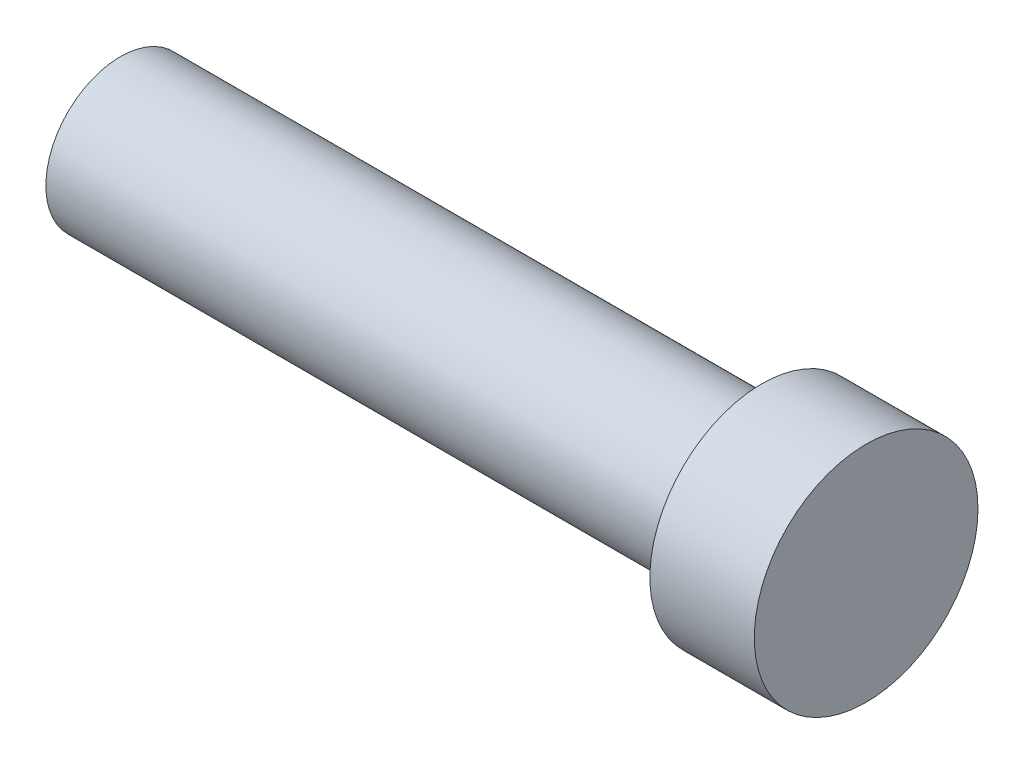
ISO-10303-21;
HEADER;
FILE_DESCRIPTION(('STEP AP214'),'2;1');
FILE_NAME('part.step','',(''),(''),'','','');
FILE_SCHEMA(('AUTOMOTIVE_DESIGN { 1 0 10303 214 1 1 1 1 }'));
ENDSEC;
DATA;
#1=APPLICATION_CONTEXT('core data for automotive mechanical design processes');
#2=APPLICATION_PROTOCOL_DEFINITION('international standard','automotive_design',2000,#1);
#3=PRODUCT_CONTEXT('',#1,'mechanical');
#4=PRODUCT('Part','Part','',(#3));
#5=PRODUCT_RELATED_PRODUCT_CATEGORY('part','',(#4));
#6=PRODUCT_DEFINITION_FORMATION('','',#4);
#7=PRODUCT_DEFINITION_CONTEXT('part definition',#1,'design');
#8=PRODUCT_DEFINITION('design','',#6,#7);
#9=PRODUCT_DEFINITION_SHAPE('','',#8);
#10=(LENGTH_UNIT() NAMED_UNIT(*) SI_UNIT(.MILLI.,.METRE.));
#11=(NAMED_UNIT(*) PLANE_ANGLE_UNIT() SI_UNIT($,.RADIAN.));
#12=(NAMED_UNIT(*) SI_UNIT($,.STERADIAN.) SOLID_ANGLE_UNIT());
#13=UNCERTAINTY_MEASURE_WITH_UNIT(LENGTH_MEASURE(1.E-05),#10,'distance_accuracy_value','');
#14=(GEOMETRIC_REPRESENTATION_CONTEXT(3) GLOBAL_UNCERTAINTY_ASSIGNED_CONTEXT((#13)) GLOBAL_UNIT_ASSIGNED_CONTEXT((#10,
#11,#12)) REPRESENTATION_CONTEXT('',''));
#15=CARTESIAN_POINT('',(0.,0.,0.));
#16=DIRECTION('',(0.,0.,1.));
#17=DIRECTION('',(1.,0.,0.));
#18=AXIS2_PLACEMENT_3D('',#15,#16,#17);
#19=CARTESIAN_POINT('',(-7.,0.,0.));
#20=DIRECTION('',(1.,0.,0.));
#21=DIRECTION('',(0.,0.,-1.));
#22=AXIS2_PLACEMENT_3D('',#19,#20,#21);
#23=CYLINDRICAL_SURFACE('',#22,7.5);
#24=CARTESIAN_POINT('',(-7.,0.,0.));
#25=DIRECTION('',(1.,0.,0.));
#26=DIRECTION('',(0.,0.,-1.));
#27=AXIS2_PLACEMENT_3D('',#24,#25,#26);
#28=CIRCLE('',#27,7.5);
#29=CARTESIAN_POINT('',(-7.,0.,-7.5));
#30=VERTEX_POINT('',#29);
#31=EDGE_CURVE('E10',#30,#30,#28,.T.);
#32=ORIENTED_EDGE('',*,*,#31,.T.);
#33=EDGE_LOOP('',(#32));
#34=FACE_BOUND('',#33,.T.);
#35=CARTESIAN_POINT('',(0.,0.,0.));
#36=DIRECTION('',(1.,0.,0.));
#37=DIRECTION('',(0.,0.,-1.));
#38=AXIS2_PLACEMENT_3D('',#35,#36,#37);
#39=CIRCLE('',#38,7.5);
#40=CARTESIAN_POINT('',(0.,0.,-7.5));
#41=VERTEX_POINT('',#40);
#42=EDGE_CURVE('E40',#41,#41,#39,.T.);
#43=ORIENTED_EDGE('',*,*,#42,.F.);
#44=EDGE_LOOP('',(#43));
#45=FACE_BOUND('',#44,.T.);
#46=ADVANCED_FACE('F37',(#34,#45),#23,.T.);
#47=CARTESIAN_POINT('',(-7.,0.,0.));
#48=DIRECTION('',(1.,0.,0.));
#49=DIRECTION('',(0.,0.,-1.));
#50=AXIS2_PLACEMENT_3D('',#47,#48,#49);
#51=PLANE('',#50);
#52=CARTESIAN_POINT('',(-7.,0.,0.));
#53=DIRECTION('',(1.,0.,0.));
#54=DIRECTION('',(0.,0.,-1.));
#55=AXIS2_PLACEMENT_3D('',#52,#53,#54);
#56=CIRCLE('',#55,5.);
#57=CARTESIAN_POINT('',(-7.,0.,-5.));
#58=VERTEX_POINT('',#57);
#59=EDGE_CURVE('E49',#58,#58,#56,.T.);
#60=ORIENTED_EDGE('',*,*,#59,.T.);
#61=EDGE_LOOP('',(#60));
#62=FACE_BOUND('',#61,.T.);
#63=ORIENTED_EDGE('',*,*,#31,.F.);
#64=EDGE_LOOP('',(#63));
#65=FACE_BOUND('',#64,.T.);
#66=ADVANCED_FACE('F71',(#62,#65),#51,.F.);
#67=CARTESIAN_POINT('',(0.,0.,0.));
#68=DIRECTION('',(1.,0.,0.));
#69=DIRECTION('',(0.,0.,-1.));
#70=AXIS2_PLACEMENT_3D('',#67,#68,#69);
#71=PLANE('',#70);
#72=ORIENTED_EDGE('',*,*,#42,.T.);
#73=EDGE_LOOP('',(#72));
#74=FACE_BOUND('',#73,.T.);
#75=ADVANCED_FACE('F68',(#74),#71,.T.);
#76=CARTESIAN_POINT('',(-50.,0.,0.));
#77=DIRECTION('',(1.,0.,0.));
#78=DIRECTION('',(0.,0.,-1.));
#79=AXIS2_PLACEMENT_3D('',#76,#77,#78);
#80=CYLINDRICAL_SURFACE('',#79,5.);
#81=CARTESIAN_POINT('',(-50.,0.,0.));
#82=DIRECTION('',(1.,0.,0.));
#83=DIRECTION('',(0.,0.,-1.));
#84=AXIS2_PLACEMENT_3D('',#81,#82,#83);
#85=CIRCLE('',#84,5.);
#86=CARTESIAN_POINT('',(-50.,0.,-5.));
#87=VERTEX_POINT('',#86);
#88=EDGE_CURVE('E54',#87,#87,#85,.T.);
#89=ORIENTED_EDGE('',*,*,#88,.T.);
#90=EDGE_LOOP('',(#89));
#91=FACE_BOUND('',#90,.T.);
#92=ORIENTED_EDGE('',*,*,#59,.F.);
#93=EDGE_LOOP('',(#92));
#94=FACE_BOUND('',#93,.T.);
#95=ADVANCED_FACE('F59',(#91,#94),#80,.T.);
#96=CARTESIAN_POINT('',(-50.,0.,0.));
#97=DIRECTION('',(1.,0.,0.));
#98=DIRECTION('',(0.,0.,-1.));
#99=AXIS2_PLACEMENT_3D('',#96,#97,#98);
#100=PLANE('',#99);
#101=ORIENTED_EDGE('',*,*,#88,.F.);
#102=EDGE_LOOP('',(#101));
#103=FACE_BOUND('',#102,.T.);
#104=ADVANCED_FACE('F62',(#103),#100,.F.);
#105=CLOSED_SHELL('',(#46,#66,#75,#95,#104));
#106=MANIFOLD_SOLID_BREP('B2',#105);
#107=ADVANCED_BREP_SHAPE_REPRESENTATION('',(#18,#106),#14);
#108=SHAPE_DEFINITION_REPRESENTATION(#9,#107);
ENDSEC;
END-ISO-10303-21;
